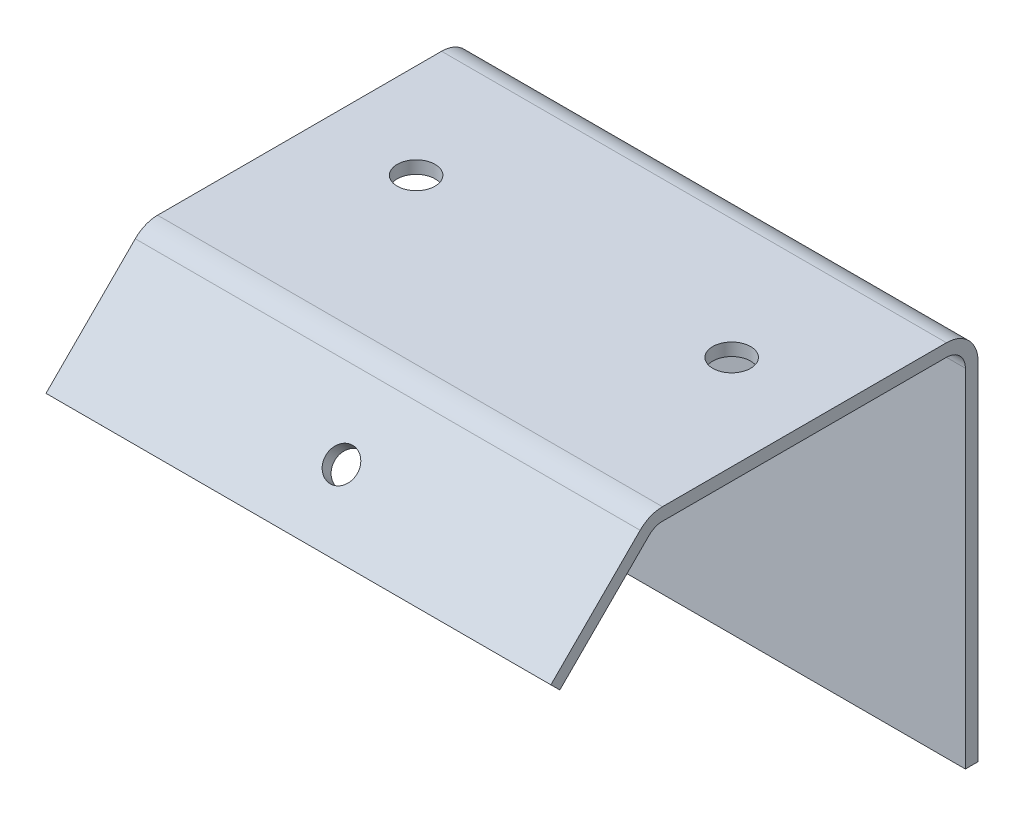
ISO-10303-21;
HEADER;
FILE_DESCRIPTION(('STEP AP214'),'2;1');
FILE_NAME('part.step','',(''),(''),'','','');
FILE_SCHEMA(('AUTOMOTIVE_DESIGN { 1 0 10303 214 1 1 1 1 }'));
ENDSEC;
DATA;
#1=APPLICATION_CONTEXT('core data for automotive mechanical design processes');
#2=APPLICATION_PROTOCOL_DEFINITION('international standard','automotive_design',2000,#1);
#3=PRODUCT_CONTEXT('',#1,'mechanical');
#4=PRODUCT('Part','Part','',(#3));
#5=PRODUCT_RELATED_PRODUCT_CATEGORY('part','',(#4));
#6=PRODUCT_DEFINITION_FORMATION('','',#4);
#7=PRODUCT_DEFINITION_CONTEXT('part definition',#1,'design');
#8=PRODUCT_DEFINITION('design','',#6,#7);
#9=PRODUCT_DEFINITION_SHAPE('','',#8);
#10=(LENGTH_UNIT() NAMED_UNIT(*) SI_UNIT(.MILLI.,.METRE.));
#11=(NAMED_UNIT(*) PLANE_ANGLE_UNIT() SI_UNIT($,.RADIAN.));
#12=(NAMED_UNIT(*) SI_UNIT($,.STERADIAN.) SOLID_ANGLE_UNIT());
#13=UNCERTAINTY_MEASURE_WITH_UNIT(LENGTH_MEASURE(1.E-05),#10,'distance_accuracy_value','');
#14=(GEOMETRIC_REPRESENTATION_CONTEXT(3) GLOBAL_UNCERTAINTY_ASSIGNED_CONTEXT((#13)) GLOBAL_UNIT_ASSIGNED_CONTEXT((#10,
#11,#12)) REPRESENTATION_CONTEXT('',''));
#15=CARTESIAN_POINT('',(0.,0.,0.));
#16=DIRECTION('',(0.,0.,1.));
#17=DIRECTION('',(1.,0.,0.));
#18=AXIS2_PLACEMENT_3D('',#15,#16,#17);
#19=CARTESIAN_POINT('',(40.,-5.28262386525342E-07,1.99999978118658));
#20=DIRECTION('',(0.,1.,0.));
#21=DIRECTION('',(0.,0.,1.));
#22=AXIS2_PLACEMENT_3D('',#19,#20,#21);
#23=PLANE('',#22);
#24=DIRECTION('',(0.,0.,-1.));
#25=VECTOR('',#24,1.);
#26=CARTESIAN_POINT('',(-40.,-5.28262386525342E-07,1.99999978118658));
#27=LINE('',#26,#25);
#28=CARTESIAN_POINT('',(-40.,-5.28262386525342E-07,1.99999978118658));
#29=VERTEX_POINT('',#28);
#30=CARTESIAN_POINT('',(-40.,-5.28262386525342E-07,-8.37711369456456E-07));
#31=VERTEX_POINT('',#30);
#32=EDGE_CURVE('E187',#29,#31,#27,.T.);
#33=ORIENTED_EDGE('',*,*,#32,.T.);
#34=DIRECTION('',(-1.,0.,0.));
#35=VECTOR('',#34,1.);
#36=CARTESIAN_POINT('',(40.,-5.28262386525342E-07,-8.37711369456456E-07));
#37=LINE('',#36,#35);
#38=CARTESIAN_POINT('',(40.,-5.28262386525342E-07,-8.37711369456456E-07));
#39=VERTEX_POINT('',#38);
#40=EDGE_CURVE('E12',#39,#31,#37,.T.);
#41=ORIENTED_EDGE('',*,*,#40,.F.);
#42=DIRECTION('',(0.,0.,-1.));
#43=VECTOR('',#42,1.);
#44=CARTESIAN_POINT('',(40.,-5.28262386525342E-07,1.99999978118658));
#45=LINE('',#44,#43);
#46=CARTESIAN_POINT('',(40.,-5.28262386525342E-07,1.99999978118658));
#47=VERTEX_POINT('',#46);
#48=EDGE_CURVE('E221',#47,#39,#45,.T.);
#49=ORIENTED_EDGE('',*,*,#48,.F.);
#50=DIRECTION('',(-1.,0.,0.));
#51=VECTOR('',#50,1.);
#52=CARTESIAN_POINT('',(40.,-5.28262386525342E-07,1.99999978118658));
#53=LINE('',#52,#51);
#54=EDGE_CURVE('E183',#47,#29,#53,.T.);
#55=ORIENTED_EDGE('',*,*,#54,.T.);
#56=EDGE_LOOP('',(#33,#41,#49,#55));
#57=FACE_BOUND('',#56,.T.);
#58=ADVANCED_FACE('F57',(#57),#23,.F.);
#59=CARTESIAN_POINT('',(40.,-5.28262386525342E-07,-8.37711369456456E-07));
#60=DIRECTION('',(0.,0.,1.));
#61=DIRECTION('',(0.,-1.,0.));
#62=AXIS2_PLACEMENT_3D('',#59,#60,#61);
#63=PLANE('',#62);
#64=CARTESIAN_POINT('',(0.,25.,0.));
#65=DIRECTION('',(0.,0.,1.));
#66=DIRECTION('',(1.,0.,0.));
#67=AXIS2_PLACEMENT_3D('',#64,#65,#66);
#68=CIRCLE('',#67,4.);
#69=CARTESIAN_POINT('',(4.,25.,0.));
#70=VERTEX_POINT('',#69);
#71=EDGE_CURVE('E257',#70,#70,#68,.T.);
#72=ORIENTED_EDGE('',*,*,#71,.T.);
#73=EDGE_LOOP('',(#72));
#74=FACE_BOUND('',#73,.T.);
#75=DIRECTION('',(0.,1.,0.));
#76=VECTOR('',#75,1.);
#77=CARTESIAN_POINT('',(-40.,-5.28262386525342E-07,-8.37711369456456E-07));
#78=LINE('',#77,#76);
#79=CARTESIAN_POINT('',(-40.,54.9999994717376,-8.37711369550418E-07));
#80=VERTEX_POINT('',#79);
#81=EDGE_CURVE('E191',#31,#80,#78,.T.);
#82=ORIENTED_EDGE('',*,*,#81,.T.);
#83=DIRECTION('',(-1.,0.,0.));
#84=VECTOR('',#83,1.);
#85=CARTESIAN_POINT('',(40.,54.9999994717376,-8.37711369550418E-07));
#86=LINE('',#85,#84);
#87=CARTESIAN_POINT('',(40.,54.9999994717376,-8.37711369550418E-07));
#88=VERTEX_POINT('',#87);
#89=EDGE_CURVE('E68',#88,#80,#86,.T.);
#90=ORIENTED_EDGE('',*,*,#89,.F.);
#91=DIRECTION('',(0.,1.,0.));
#92=VECTOR('',#91,1.);
#93=CARTESIAN_POINT('',(40.,-5.28262386525342E-07,-8.37711369456456E-07));
#94=LINE('',#93,#92);
#95=EDGE_CURVE('E132',#39,#88,#94,.T.);
#96=ORIENTED_EDGE('',*,*,#95,.F.);
#97=ORIENTED_EDGE('',*,*,#40,.T.);
#98=EDGE_LOOP('',(#82,#90,#96,#97));
#99=FACE_BOUND('',#98,.T.);
#100=ADVANCED_FACE('F351',(#74,#99),#63,.F.);
#101=CARTESIAN_POINT('',(40.,54.9999997929033,4.99999946002087));
#102=DIRECTION('',(-1.,0.,0.));
#103=DIRECTION('',(0.,0.,1.));
#104=AXIS2_PLACEMENT_3D('',#101,#102,#103);
#105=CYLINDRICAL_SURFACE('',#104,5.00000029773225);
#106=CARTESIAN_POINT('',(-40.,54.9999997929033,4.99999946002087));
#107=DIRECTION('',(1.,0.,0.));
#108=DIRECTION('',(0.,0.,-1.));
#109=AXIS2_PLACEMENT_3D('',#106,#107,#108);
#110=CIRCLE('',#109,5.00000029773225);
#111=CARTESIAN_POINT('',(-40.,60.0000000906356,4.99999978118641));
#112=VERTEX_POINT('',#111);
#113=EDGE_CURVE('E195',#80,#112,#110,.T.);
#114=ORIENTED_EDGE('',*,*,#113,.T.);
#115=DIRECTION('',(-1.,0.,0.));
#116=VECTOR('',#115,1.);
#117=CARTESIAN_POINT('',(40.,60.0000000906356,4.99999978118641));
#118=LINE('',#117,#116);
#119=CARTESIAN_POINT('',(40.,60.0000000906356,4.99999978118641));
#120=VERTEX_POINT('',#119);
#121=EDGE_CURVE('E247',#120,#112,#118,.T.);
#122=ORIENTED_EDGE('',*,*,#121,.F.);
#123=CARTESIAN_POINT('',(40.,54.9999997929033,4.99999946002087));
#124=DIRECTION('',(1.,0.,0.));
#125=DIRECTION('',(0.,0.,-1.));
#126=AXIS2_PLACEMENT_3D('',#123,#124,#125);
#127=CIRCLE('',#126,5.00000029773225);
#128=EDGE_CURVE('E281',#88,#120,#127,.T.);
#129=ORIENTED_EDGE('',*,*,#128,.F.);
#130=ORIENTED_EDGE('',*,*,#89,.T.);
#131=EDGE_LOOP('',(#114,#122,#129,#130));
#132=FACE_BOUND('',#131,.T.);
#133=ADVANCED_FACE('F319',(#132),#105,.T.);
#134=CARTESIAN_POINT('',(40.,60.0000000906356,4.99999978118641));
#135=DIRECTION('',(0.,-1.,0.));
#136=DIRECTION('',(0.,0.,-1.));
#137=AXIS2_PLACEMENT_3D('',#134,#135,#136);
#138=PLANE('',#137);
#139=CARTESIAN_POINT('',(-25.,60.,24.031));
#140=DIRECTION('',(0.,1.,0.));
#141=DIRECTION('',(0.,0.,1.));
#142=AXIS2_PLACEMENT_3D('',#139,#140,#141);
#143=CIRCLE('',#142,3.);
#144=CARTESIAN_POINT('',(-25.,60.,27.031));
#145=VERTEX_POINT('',#144);
#146=EDGE_CURVE('E262',#145,#145,#143,.T.);
#147=ORIENTED_EDGE('',*,*,#146,.F.);
#148=EDGE_LOOP('',(#147));
#149=FACE_BOUND('',#148,.T.);
#150=CARTESIAN_POINT('',(25.,60.,24.031));
#151=DIRECTION('',(0.,1.,0.));
#152=DIRECTION('',(0.,0.,1.));
#153=AXIS2_PLACEMENT_3D('',#150,#151,#152);
#154=CIRCLE('',#153,3.);
#155=CARTESIAN_POINT('',(25.,60.,27.031));
#156=VERTEX_POINT('',#155);
#157=EDGE_CURVE('E275',#156,#156,#154,.T.);
#158=ORIENTED_EDGE('',*,*,#157,.F.);
#159=EDGE_LOOP('',(#158));
#160=FACE_BOUND('',#159,.T.);
#161=DIRECTION('',(0.,0.,1.));
#162=VECTOR('',#161,1.);
#163=CARTESIAN_POINT('',(-40.,60.0000000906356,4.99999978118641));
#164=LINE('',#163,#162);
#165=CARTESIAN_POINT('',(-40.,60.0000000906356,49.9999997811864));
#166=VERTEX_POINT('',#165);
#167=EDGE_CURVE('E198',#112,#166,#164,.T.);
#168=ORIENTED_EDGE('',*,*,#167,.T.);
#169=DIRECTION('',(-1.,0.,0.));
#170=VECTOR('',#169,1.);
#171=CARTESIAN_POINT('',(40.,60.0000000906356,49.9999997811864));
#172=LINE('',#171,#170);
#173=CARTESIAN_POINT('',(40.,60.0000000906356,49.9999997811864));
#174=VERTEX_POINT('',#173);
#175=EDGE_CURVE('E243',#174,#166,#172,.T.);
#176=ORIENTED_EDGE('',*,*,#175,.F.);
#177=DIRECTION('',(0.,0.,1.));
#178=VECTOR('',#177,1.);
#179=CARTESIAN_POINT('',(40.,60.0000000906356,4.99999978118641));
#180=LINE('',#179,#178);
#181=EDGE_CURVE('E284',#120,#174,#180,.T.);
#182=ORIENTED_EDGE('',*,*,#181,.F.);
#183=ORIENTED_EDGE('',*,*,#121,.T.);
#184=EDGE_LOOP('',(#168,#176,#182,#183));
#185=FACE_BOUND('',#184,.T.);
#186=ADVANCED_FACE('F315',(#149,#160,#185),#138,.F.);
#187=CARTESIAN_POINT('',(40.,55.0000019395586,50.0000008633479));
#188=DIRECTION('',(-1.,0.,0.));
#189=DIRECTION('',(0.,0.,1.));
#190=AXIS2_PLACEMENT_3D('',#187,#188,#189);
#191=CYLINDRICAL_SURFACE('',#190,4.99999815107709);
#192=CARTESIAN_POINT('',(-40.,55.0000019395586,50.0000008633479));
#193=DIRECTION('',(1.,0.,0.));
#194=DIRECTION('',(0.,0.,-1.));
#195=AXIS2_PLACEMENT_3D('',#192,#193,#194);
#196=CIRCLE('',#195,4.99999815107709);
#197=CARTESIAN_POINT('',(-40.,58.535534,53.535534));
#198=VERTEX_POINT('',#197);
#199=EDGE_CURVE('E201',#166,#198,#196,.T.);
#200=ORIENTED_EDGE('',*,*,#199,.T.);
#201=DIRECTION('',(-1.,0.,0.));
#202=VECTOR('',#201,1.);
#203=CARTESIAN_POINT('',(40.,58.535534,53.535534));
#204=LINE('',#203,#202);
#205=CARTESIAN_POINT('',(40.,58.535534,53.535534));
#206=VERTEX_POINT('',#205);
#207=EDGE_CURVE('E239',#206,#198,#204,.T.);
#208=ORIENTED_EDGE('',*,*,#207,.F.);
#209=CARTESIAN_POINT('',(40.,55.0000019395586,50.0000008633479));
#210=DIRECTION('',(1.,0.,0.));
#211=DIRECTION('',(0.,0.,-1.));
#212=AXIS2_PLACEMENT_3D('',#209,#210,#211);
#213=CIRCLE('',#212,4.99999815107709);
#214=EDGE_CURVE('E287',#174,#206,#213,.T.);
#215=ORIENTED_EDGE('',*,*,#214,.F.);
#216=ORIENTED_EDGE('',*,*,#175,.T.);
#217=EDGE_LOOP('',(#200,#208,#215,#216));
#218=FACE_BOUND('',#217,.T.);
#219=ADVANCED_FACE('F318',(#218),#191,.T.);
#220=CARTESIAN_POINT('',(40.,58.535534,53.535534));
#221=DIRECTION('',(0.,-0.707106781186548,-0.707106781186547));
#222=DIRECTION('',(0.,0.707106781186547,-0.707106781186548));
#223=AXIS2_PLACEMENT_3D('',#220,#221,#222);
#224=PLANE('',#223);
#225=CARTESIAN_POINT('',(0.,51.213034,60.858034));
#226=DIRECTION('',(0.,-0.707106781186548,-0.707106781186547));
#227=DIRECTION('',(0.,0.707106781186547,-0.707106781186548));
#228=AXIS2_PLACEMENT_3D('',#225,#226,#227);
#229=CIRCLE('',#228,2.5);
#230=CARTESIAN_POINT('',(0.,52.9808009529664,59.0902670470336));
#231=VERTEX_POINT('',#230);
#232=EDGE_CURVE('E300',#231,#231,#229,.T.);
#233=ORIENTED_EDGE('',*,*,#232,.T.);
#234=EDGE_LOOP('',(#233));
#235=FACE_BOUND('',#234,.T.);
#236=DIRECTION('',(0.,-0.707106781186547,0.707106781186548));
#237=VECTOR('',#236,1.);
#238=CARTESIAN_POINT('',(-40.,58.535534,53.535534));
#239=LINE('',#238,#237);
#240=CARTESIAN_POINT('',(-40.,44.393398,67.67767));
#241=VERTEX_POINT('',#240);
#242=EDGE_CURVE('E204',#198,#241,#239,.T.);
#243=ORIENTED_EDGE('',*,*,#242,.T.);
#244=DIRECTION('',(-1.,0.,0.));
#245=VECTOR('',#244,1.);
#246=CARTESIAN_POINT('',(40.,44.393398,67.67767));
#247=LINE('',#246,#245);
#248=CARTESIAN_POINT('',(40.,44.393398,67.67767));
#249=VERTEX_POINT('',#248);
#250=EDGE_CURVE('E236',#249,#241,#247,.T.);
#251=ORIENTED_EDGE('',*,*,#250,.F.);
#252=DIRECTION('',(0.,-0.707106781186547,0.707106781186548));
#253=VECTOR('',#252,1.);
#254=CARTESIAN_POINT('',(40.,58.535534,53.535534));
#255=LINE('',#254,#253);
#256=EDGE_CURVE('E290',#206,#249,#255,.T.);
#257=ORIENTED_EDGE('',*,*,#256,.F.);
#258=ORIENTED_EDGE('',*,*,#207,.T.);
#259=EDGE_LOOP('',(#243,#251,#257,#258));
#260=FACE_BOUND('',#259,.T.);
#261=ADVANCED_FACE('F340',(#235,#260),#224,.F.);
#262=CARTESIAN_POINT('',(40.,44.393398,67.67767));
#263=DIRECTION('',(0.,0.707158756840208,-0.707054801712153));
#264=DIRECTION('',(0.,0.707054801712153,0.707158756840208));
#265=AXIS2_PLACEMENT_3D('',#262,#263,#264);
#266=PLANE('',#265);
#267=DIRECTION('',(0.,-0.707054801712153,-0.707158756840208));
#268=VECTOR('',#267,1.);
#269=CARTESIAN_POINT('',(-40.,44.393398,67.67767));
#270=LINE('',#269,#268);
#271=CARTESIAN_POINT('',(-40.,42.978678,66.262742));
#272=VERTEX_POINT('',#271);
#273=EDGE_CURVE('E207',#241,#272,#270,.T.);
#274=ORIENTED_EDGE('',*,*,#273,.T.);
#275=DIRECTION('',(-1.,0.,0.));
#276=VECTOR('',#275,1.);
#277=CARTESIAN_POINT('',(40.,42.978678,66.262742));
#278=LINE('',#277,#276);
#279=CARTESIAN_POINT('',(40.,42.978678,66.262742));
#280=VERTEX_POINT('',#279);
#281=EDGE_CURVE('E232',#280,#272,#278,.T.);
#282=ORIENTED_EDGE('',*,*,#281,.F.);
#283=DIRECTION('',(0.,-0.707054801712153,-0.707158756840208));
#284=VECTOR('',#283,1.);
#285=CARTESIAN_POINT('',(40.,44.393398,67.67767));
#286=LINE('',#285,#284);
#287=EDGE_CURVE('E293',#249,#280,#286,.T.);
#288=ORIENTED_EDGE('',*,*,#287,.F.);
#289=ORIENTED_EDGE('',*,*,#250,.T.);
#290=EDGE_LOOP('',(#274,#282,#288,#289));
#291=FACE_BOUND('',#290,.T.);
#292=ADVANCED_FACE('F344',(#291),#266,.F.);
#293=CARTESIAN_POINT('',(40.,42.978678,66.262742));
#294=DIRECTION('',(0.,0.707076280305296,0.707137280752208));
#295=DIRECTION('',(0.,-0.707137280752208,0.707076280305296));
#296=AXIS2_PLACEMENT_3D('',#293,#294,#295);
#297=PLANE('',#296);
#298=CARTESIAN_POINT('',(0.,49.798504152532,59.443504152532));
#299=DIRECTION('',(0.,0.707076280305296,0.707137280752208));
#300=DIRECTION('',(0.,-0.707137280752208,0.707076280305296));
#301=AXIS2_PLACEMENT_3D('',#298,#299,#300);
#302=ELLIPSE('',#301,2.50000000232566,2.5);
#303=CARTESIAN_POINT('',(0.,48.0306609490069,61.2111948549396));
#304=VERTEX_POINT('',#303);
#305=EDGE_CURVE('E61',#304,#304,#302,.T.);
#306=ORIENTED_EDGE('',*,*,#305,.T.);
#307=EDGE_LOOP('',(#306));
#308=FACE_BOUND('',#307,.T.);
#309=DIRECTION('',(0.,0.707137280752208,-0.707076280305296));
#310=VECTOR('',#309,1.);
#311=CARTESIAN_POINT('',(-40.,42.978678,66.262742));
#312=LINE('',#311,#310);
#313=CARTESIAN_POINT('',(-40.,57.12132,52.12132));
#314=VERTEX_POINT('',#313);
#315=EDGE_CURVE('E210',#272,#314,#312,.T.);
#316=ORIENTED_EDGE('',*,*,#315,.T.);
#317=DIRECTION('',(-1.,0.,0.));
#318=VECTOR('',#317,1.);
#319=CARTESIAN_POINT('',(40.,57.12132,52.12132));
#320=LINE('',#319,#318);
#321=CARTESIAN_POINT('',(40.,57.12132,52.12132));
#322=VERTEX_POINT('',#321);
#323=EDGE_CURVE('E228',#322,#314,#320,.T.);
#324=ORIENTED_EDGE('',*,*,#323,.F.);
#325=DIRECTION('',(0.,0.707137280752208,-0.707076280305296));
#326=VECTOR('',#325,1.);
#327=CARTESIAN_POINT('',(40.,42.978678,66.262742));
#328=LINE('',#327,#326);
#329=EDGE_CURVE('E295',#280,#322,#328,.T.);
#330=ORIENTED_EDGE('',*,*,#329,.F.);
#331=ORIENTED_EDGE('',*,*,#281,.T.);
#332=EDGE_LOOP('',(#316,#324,#330,#331));
#333=FACE_BOUND('',#332,.T.);
#334=ADVANCED_FACE('F359',(#308,#333),#297,.F.);
#335=CARTESIAN_POINT('',(40.,55.0000019395586,50.0000008633479));
#336=DIRECTION('',(-1.,0.,0.));
#337=DIRECTION('',(0.,0.,1.));
#338=AXIS2_PLACEMENT_3D('',#335,#336,#337);
#339=CYLINDRICAL_SURFACE('',#338,2.99999753217922);
#340=CARTESIAN_POINT('',(-40.,55.0000019395586,50.0000008633479));
#341=DIRECTION('',(-1.,0.,0.));
#342=DIRECTION('',(0.,0.,1.));
#343=AXIS2_PLACEMENT_3D('',#340,#341,#342);
#344=CIRCLE('',#343,2.99999753217922);
#345=CARTESIAN_POINT('',(-40.,57.9999994717376,49.9999997811866));
#346=VERTEX_POINT('',#345);
#347=EDGE_CURVE('E212',#314,#346,#344,.T.);
#348=ORIENTED_EDGE('',*,*,#347,.T.);
#349=DIRECTION('',(-1.,0.,0.));
#350=VECTOR('',#349,1.);
#351=CARTESIAN_POINT('',(40.,57.9999994717376,49.9999997811866));
#352=LINE('',#351,#350);
#353=CARTESIAN_POINT('',(40.,57.9999994717376,49.9999997811866));
#354=VERTEX_POINT('',#353);
#355=EDGE_CURVE('E174',#354,#346,#352,.T.);
#356=ORIENTED_EDGE('',*,*,#355,.F.);
#357=CARTESIAN_POINT('',(40.,55.0000019395586,50.0000008633479));
#358=DIRECTION('',(-1.,0.,0.));
#359=DIRECTION('',(0.,0.,1.));
#360=AXIS2_PLACEMENT_3D('',#357,#358,#359);
#361=CIRCLE('',#360,2.99999753217922);
#362=EDGE_CURVE('E163',#322,#354,#361,.T.);
#363=ORIENTED_EDGE('',*,*,#362,.F.);
#364=ORIENTED_EDGE('',*,*,#323,.T.);
#365=EDGE_LOOP('',(#348,#356,#363,#364));
#366=FACE_BOUND('',#365,.T.);
#367=ADVANCED_FACE('F357',(#366),#339,.F.);
#368=CARTESIAN_POINT('',(40.,57.9999994717376,49.9999997811866));
#369=DIRECTION('',(0.,1.,0.));
#370=DIRECTION('',(0.,0.,1.));
#371=AXIS2_PLACEMENT_3D('',#368,#369,#370);
#372=PLANE('',#371);
#373=CARTESIAN_POINT('',(-25.,57.9999994717376,24.031));
#374=DIRECTION('',(0.,1.,0.));
#375=DIRECTION('',(0.,0.,1.));
#376=AXIS2_PLACEMENT_3D('',#373,#374,#375);
#377=CIRCLE('',#376,3.);
#378=CARTESIAN_POINT('',(-25.,57.9999994717376,27.031));
#379=VERTEX_POINT('',#378);
#380=EDGE_CURVE('E261',#379,#379,#377,.T.);
#381=ORIENTED_EDGE('',*,*,#380,.T.);
#382=EDGE_LOOP('',(#381));
#383=FACE_BOUND('',#382,.T.);
#384=CARTESIAN_POINT('',(25.,57.9999994717376,24.031));
#385=DIRECTION('',(0.,1.,0.));
#386=DIRECTION('',(0.,0.,1.));
#387=AXIS2_PLACEMENT_3D('',#384,#385,#386);
#388=CIRCLE('',#387,3.);
#389=CARTESIAN_POINT('',(25.,57.9999994717376,27.031));
#390=VERTEX_POINT('',#389);
#391=EDGE_CURVE('E258',#390,#390,#388,.T.);
#392=ORIENTED_EDGE('',*,*,#391,.T.);
#393=EDGE_LOOP('',(#392));
#394=FACE_BOUND('',#393,.T.);
#395=DIRECTION('',(0.,0.,-1.));
#396=VECTOR('',#395,1.);
#397=CARTESIAN_POINT('',(-40.,57.9999994717376,49.9999997811866));
#398=LINE('',#397,#396);
#399=CARTESIAN_POINT('',(-40.,57.9999994717376,4.99999978118659));
#400=VERTEX_POINT('',#399);
#401=EDGE_CURVE('E172',#346,#400,#398,.T.);
#402=ORIENTED_EDGE('',*,*,#401,.T.);
#403=DIRECTION('',(-1.,0.,0.));
#404=VECTOR('',#403,1.);
#405=CARTESIAN_POINT('',(40.,57.9999994717376,4.99999978118659));
#406=LINE('',#405,#404);
#407=CARTESIAN_POINT('',(40.,57.9999994717376,4.99999978118659));
#408=VERTEX_POINT('',#407);
#409=EDGE_CURVE('E169',#408,#400,#406,.T.);
#410=ORIENTED_EDGE('',*,*,#409,.F.);
#411=DIRECTION('',(0.,0.,-1.));
#412=VECTOR('',#411,1.);
#413=CARTESIAN_POINT('',(40.,57.9999994717376,49.9999997811866));
#414=LINE('',#413,#412);
#415=EDGE_CURVE('E157',#354,#408,#414,.T.);
#416=ORIENTED_EDGE('',*,*,#415,.F.);
#417=ORIENTED_EDGE('',*,*,#355,.T.);
#418=EDGE_LOOP('',(#402,#410,#416,#417));
#419=FACE_BOUND('',#418,.T.);
#420=ADVANCED_FACE('F170',(#383,#394,#419),#372,.F.);
#421=CARTESIAN_POINT('',(40.,54.9999997929033,4.99999946002087));
#422=DIRECTION('',(-1.,0.,0.));
#423=DIRECTION('',(0.,0.,1.));
#424=AXIS2_PLACEMENT_3D('',#421,#422,#423);
#425=CYLINDRICAL_SURFACE('',#424,2.9999996788343);
#426=CARTESIAN_POINT('',(-40.,54.9999997929033,4.99999946002087));
#427=DIRECTION('',(-1.,0.,0.));
#428=DIRECTION('',(0.,0.,1.));
#429=AXIS2_PLACEMENT_3D('',#426,#427,#428);
#430=CIRCLE('',#429,2.9999996788343);
#431=CARTESIAN_POINT('',(-40.,54.9999994717376,1.99999978118658));
#432=VERTEX_POINT('',#431);
#433=EDGE_CURVE('E118',#400,#432,#430,.T.);
#434=ORIENTED_EDGE('',*,*,#433,.T.);
#435=DIRECTION('',(-1.,0.,0.));
#436=VECTOR('',#435,1.);
#437=CARTESIAN_POINT('',(40.,54.9999994717376,1.99999978118658));
#438=LINE('',#437,#436);
#439=CARTESIAN_POINT('',(40.,54.9999994717376,1.99999978118658));
#440=VERTEX_POINT('',#439);
#441=EDGE_CURVE('E175',#440,#432,#438,.T.);
#442=ORIENTED_EDGE('',*,*,#441,.F.);
#443=CARTESIAN_POINT('',(40.,54.9999997929033,4.99999946002087));
#444=DIRECTION('',(-1.,0.,0.));
#445=DIRECTION('',(0.,0.,1.));
#446=AXIS2_PLACEMENT_3D('',#443,#444,#445);
#447=CIRCLE('',#446,2.9999996788343);
#448=EDGE_CURVE('E161',#408,#440,#447,.T.);
#449=ORIENTED_EDGE('',*,*,#448,.F.);
#450=ORIENTED_EDGE('',*,*,#409,.T.);
#451=EDGE_LOOP('',(#434,#442,#449,#450));
#452=FACE_BOUND('',#451,.T.);
#453=ADVANCED_FACE('F177',(#452),#425,.F.);
#454=CARTESIAN_POINT('',(40.,54.9999994717376,1.99999978118658));
#455=DIRECTION('',(0.,0.,-1.));
#456=DIRECTION('',(-1.,0.,0.));
#457=AXIS2_PLACEMENT_3D('',#454,#455,#456);
#458=PLANE('',#457);
#459=CARTESIAN_POINT('',(0.,25.,1.99999978118658));
#460=DIRECTION('',(0.,0.,-1.));
#461=DIRECTION('',(-1.,0.,0.));
#462=AXIS2_PLACEMENT_3D('',#459,#460,#461);
#463=CIRCLE('',#462,4.);
#464=CARTESIAN_POINT('',(-4.,25.,1.99999978118658));
#465=VERTEX_POINT('',#464);
#466=EDGE_CURVE('E192',#465,#465,#463,.F.);
#467=ORIENTED_EDGE('',*,*,#466,.F.);
#468=EDGE_LOOP('',(#467));
#469=FACE_BOUND('',#468,.T.);
#470=DIRECTION('',(0.,-1.,0.));
#471=VECTOR('',#470,1.);
#472=CARTESIAN_POINT('',(-40.,54.9999994717376,1.99999978118658));
#473=LINE('',#472,#471);
#474=EDGE_CURVE('E124',#432,#29,#473,.T.);
#475=ORIENTED_EDGE('',*,*,#474,.T.);
#476=ORIENTED_EDGE('',*,*,#54,.F.);
#477=DIRECTION('',(0.,-1.,0.));
#478=VECTOR('',#477,1.);
#479=CARTESIAN_POINT('',(40.,54.9999994717376,1.99999978118658));
#480=LINE('',#479,#478);
#481=EDGE_CURVE('E77',#440,#47,#480,.T.);
#482=ORIENTED_EDGE('',*,*,#481,.F.);
#483=ORIENTED_EDGE('',*,*,#441,.T.);
#484=EDGE_LOOP('',(#475,#476,#482,#483));
#485=FACE_BOUND('',#484,.T.);
#486=ADVANCED_FACE('F354',(#469,#485),#458,.F.);
#487=CARTESIAN_POINT('',(40.,54.9999997929033,4.99999946002087));
#488=DIRECTION('',(1.,0.,0.));
#489=DIRECTION('',(0.,0.,-1.));
#490=AXIS2_PLACEMENT_3D('',#487,#488,#489);
#491=PLANE('',#490);
#492=ORIENTED_EDGE('',*,*,#48,.T.);
#493=ORIENTED_EDGE('',*,*,#95,.T.);
#494=ORIENTED_EDGE('',*,*,#128,.T.);
#495=ORIENTED_EDGE('',*,*,#181,.T.);
#496=ORIENTED_EDGE('',*,*,#214,.T.);
#497=ORIENTED_EDGE('',*,*,#256,.T.);
#498=ORIENTED_EDGE('',*,*,#287,.T.);
#499=ORIENTED_EDGE('',*,*,#329,.T.);
#500=ORIENTED_EDGE('',*,*,#362,.T.);
#501=ORIENTED_EDGE('',*,*,#415,.T.);
#502=ORIENTED_EDGE('',*,*,#448,.T.);
#503=ORIENTED_EDGE('',*,*,#481,.T.);
#504=EDGE_LOOP('',(#492,#493,#494,#495,#496,#497,#498,#499,#500,#501,#502,#503));
#505=FACE_BOUND('',#504,.T.);
#506=ADVANCED_FACE('F159',(#505),#491,.T.);
#507=CARTESIAN_POINT('',(-40.,54.9999997929033,4.99999946002087));
#508=DIRECTION('',(1.,0.,0.));
#509=DIRECTION('',(0.,0.,-1.));
#510=AXIS2_PLACEMENT_3D('',#507,#508,#509);
#511=PLANE('',#510);
#512=ORIENTED_EDGE('',*,*,#32,.F.);
#513=ORIENTED_EDGE('',*,*,#474,.F.);
#514=ORIENTED_EDGE('',*,*,#433,.F.);
#515=ORIENTED_EDGE('',*,*,#401,.F.);
#516=ORIENTED_EDGE('',*,*,#347,.F.);
#517=ORIENTED_EDGE('',*,*,#315,.F.);
#518=ORIENTED_EDGE('',*,*,#273,.F.);
#519=ORIENTED_EDGE('',*,*,#242,.F.);
#520=ORIENTED_EDGE('',*,*,#199,.F.);
#521=ORIENTED_EDGE('',*,*,#167,.F.);
#522=ORIENTED_EDGE('',*,*,#113,.F.);
#523=ORIENTED_EDGE('',*,*,#81,.F.);
#524=EDGE_LOOP('',(#512,#513,#514,#515,#516,#517,#518,#519,#520,#521,#522,#523));
#525=FACE_BOUND('',#524,.T.);
#526=ADVANCED_FACE('F335',(#525),#511,.F.);
#527=CARTESIAN_POINT('',(0.,25.,67.67767));
#528=DIRECTION('',(0.,0.,-1.));
#529=DIRECTION('',(-1.,0.,0.));
#530=AXIS2_PLACEMENT_3D('',#527,#528,#529);
#531=CYLINDRICAL_SURFACE('',#530,4.);
#532=ORIENTED_EDGE('',*,*,#71,.F.);
#533=EDGE_LOOP('',(#532));
#534=FACE_BOUND('',#533,.T.);
#535=ORIENTED_EDGE('',*,*,#466,.T.);
#536=EDGE_LOOP('',(#535));
#537=FACE_BOUND('',#536,.T.);
#538=ADVANCED_FACE('F399',(#534,#537),#531,.F.);
#539=CARTESIAN_POINT('',(25.,-5.28262385224298E-07,24.031));
#540=DIRECTION('',(0.,1.,0.));
#541=DIRECTION('',(0.,0.,1.));
#542=AXIS2_PLACEMENT_3D('',#539,#540,#541);
#543=CYLINDRICAL_SURFACE('',#542,3.);
#544=CARTESIAN_POINT('',(25.,60.,27.031));
#545=CARTESIAN_POINT('',(25.,59.9791666611639,27.031));
#546=CARTESIAN_POINT('',(25.,59.9583333223279,27.031));
#547=CARTESIAN_POINT('',(25.,59.9166666446557,27.031));
#548=CARTESIAN_POINT('',(25.,59.8958333058197,27.031));
#549=CARTESIAN_POINT('',(25.,59.8541666281475,27.031));
#550=CARTESIAN_POINT('',(25.,59.8333332893115,27.031));
#551=CARTESIAN_POINT('',(25.,59.7916666116393,27.031));
#552=CARTESIAN_POINT('',(25.,59.7708332728033,27.031));
#553=CARTESIAN_POINT('',(25.,59.7291665951311,27.031));
#554=CARTESIAN_POINT('',(25.,59.7083332562951,27.031));
#555=CARTESIAN_POINT('',(25.,59.6666665786229,27.031));
#556=CARTESIAN_POINT('',(25.,59.6458332397869,27.031));
#557=CARTESIAN_POINT('',(25.,59.6041665621147,27.031));
#558=CARTESIAN_POINT('',(25.,59.5833332232787,27.031));
#559=CARTESIAN_POINT('',(25.,59.5416665456065,27.031));
#560=CARTESIAN_POINT('',(25.,59.5208332067705,27.031));
#561=CARTESIAN_POINT('',(25.,59.4791665290983,27.031));
#562=CARTESIAN_POINT('',(25.,59.4583331902623,27.031));
#563=CARTESIAN_POINT('',(25.,59.4166665125901,27.031));
#564=CARTESIAN_POINT('',(25.,59.3958331737541,27.031));
#565=CARTESIAN_POINT('',(25.,59.3541664960819,27.031));
#566=CARTESIAN_POINT('',(25.,59.3333331572459,27.031));
#567=CARTESIAN_POINT('',(25.,59.2916664795737,27.031));
#568=CARTESIAN_POINT('',(25.,59.2708331407377,27.031));
#569=CARTESIAN_POINT('',(25.,59.2291664630655,27.031));
#570=CARTESIAN_POINT('',(25.,59.2083331242295,27.031));
#571=CARTESIAN_POINT('',(25.,59.1666664465573,27.031));
#572=CARTESIAN_POINT('',(25.,59.1458331077213,27.031));
#573=CARTESIAN_POINT('',(25.,59.1041664300491,27.031));
#574=CARTESIAN_POINT('',(25.,59.0833330912131,27.031));
#575=CARTESIAN_POINT('',(25.,59.0416664135409,27.031));
#576=CARTESIAN_POINT('',(25.,59.0208330747049,27.031));
#577=CARTESIAN_POINT('',(25.,58.9791663970327,27.031));
#578=CARTESIAN_POINT('',(25.,58.9583330581967,27.031));
#579=CARTESIAN_POINT('',(25.,58.9166663805245,27.031));
#580=CARTESIAN_POINT('',(25.,58.8958330416885,27.031));
#581=CARTESIAN_POINT('',(25.,58.8541663640163,27.031));
#582=CARTESIAN_POINT('',(25.,58.8333330251803,27.031));
#583=CARTESIAN_POINT('',(25.,58.7916663475081,27.031));
#584=CARTESIAN_POINT('',(25.,58.7708330086721,27.031));
#585=CARTESIAN_POINT('',(25.,58.7291663309999,27.031));
#586=CARTESIAN_POINT('',(25.,58.7083329921639,27.031));
#587=CARTESIAN_POINT('',(25.,58.6666663144917,27.031));
#588=CARTESIAN_POINT('',(25.,58.6458329756557,27.031));
#589=CARTESIAN_POINT('',(25.,58.6041662979835,27.031));
#590=CARTESIAN_POINT('',(25.,58.5833329591475,27.031));
#591=CARTESIAN_POINT('',(25.,58.5416662814753,27.031));
#592=CARTESIAN_POINT('',(25.,58.5208329426393,27.031));
#593=CARTESIAN_POINT('',(25.,58.4791662649671,27.031));
#594=CARTESIAN_POINT('',(25.,58.4583329261311,27.031));
#595=CARTESIAN_POINT('',(25.,58.4166662484589,27.031));
#596=CARTESIAN_POINT('',(25.,58.3958329096229,27.031));
#597=CARTESIAN_POINT('',(25.,58.3541662319507,27.031));
#598=CARTESIAN_POINT('',(25.,58.3333328931147,27.031));
#599=CARTESIAN_POINT('',(25.,58.2916662154425,27.031));
#600=CARTESIAN_POINT('',(25.,58.2708328766065,27.031));
#601=CARTESIAN_POINT('',(25.,58.2291661989343,27.031));
#602=CARTESIAN_POINT('',(25.,58.2083328600983,27.031));
#603=CARTESIAN_POINT('',(25.,58.1666661824261,27.031));
#604=CARTESIAN_POINT('',(25.,58.1458328435901,27.031));
#605=CARTESIAN_POINT('',(25.,58.1041661659179,27.031));
#606=CARTESIAN_POINT('',(25.,58.0833328270819,27.031));
#607=CARTESIAN_POINT('',(25.,58.0416661494097,27.031));
#608=CARTESIAN_POINT('',(25.,58.0208328105737,27.031));
#609=CARTESIAN_POINT('',(25.,57.9999994717376,27.031));
#610=B_SPLINE_CURVE_WITH_KNOTS('',3,(#544,#545,#546,#547,#548,#549,#550,#551,#552,#553,#554,
#555,#556,#557,#558,#559,#560,#561,#562,#563,#564,#565,#566,#567,#568,#569,#570,#571,#572,#573,
#574,#575,#576,#577,#578,#579,#580,#581,#582,#583,#584,#585,#586,#587,#588,#589,#590,#591,#592,
#593,#594,#595,#596,#597,#598,#599,#600,#601,#602,#603,#604,#605,#606,#607,#608,#609),
.UNSPECIFIED.,.F.,.F.,(4,2,2,2,2,2,2,2,2,2,2,2,2,2,2,2,2,2,2,2,2,2,2,2,2,2,2,2,2,2,2,2,4),(0.,
0.0625000165081976,0.125000033016402,0.1875000495246,0.250000066032798,0.312500082541002,
0.3750000990492,0.437500115557397,0.500000132065595,0.5625001485738,0.625000165081997,
0.687500181590195,0.750000198098399,0.812500214606597,0.875000231114795,0.937500247622999,
1.0000002641312,1.06250028063939,1.1250002971476,1.1875003136558,1.25000033016399,
1.3125003466722,1.3750003631804,1.43750037968859,1.5000003961968,1.562500412705,
1.62500042921319,1.68750044572139,1.7500004622296,1.81250047873779,1.87500049524599,
1.9375005117542,2.00000052826239),.UNSPECIFIED.);
#611=EDGE_CURVE('BSEAM402',#156,#390,#610,.T.);
#612=ORIENTED_EDGE('',*,*,#157,.T.);
#613=ORIENTED_EDGE('',*,*,#391,.F.);
#614=ORIENTED_EDGE('',*,*,#611,.T.);
#615=ORIENTED_EDGE('',*,*,#611,.F.);
#616=EDGE_LOOP('',(#612,#614,#613,#615));
#617=FACE_BOUND('',#616,.T.);
#618=ADVANCED_FACE('F402',(#617),#543,.F.);
#619=CARTESIAN_POINT('',(-25.,-5.28262385224298E-07,24.031));
#620=DIRECTION('',(0.,1.,0.));
#621=DIRECTION('',(0.,0.,1.));
#622=AXIS2_PLACEMENT_3D('',#619,#620,#621);
#623=CYLINDRICAL_SURFACE('',#622,3.);
#624=CARTESIAN_POINT('',(-25.,60.,27.031));
#625=CARTESIAN_POINT('',(-25.,59.9791666611639,27.031));
#626=CARTESIAN_POINT('',(-25.,59.9583333223279,27.031));
#627=CARTESIAN_POINT('',(-25.,59.9166666446557,27.031));
#628=CARTESIAN_POINT('',(-25.,59.8958333058197,27.031));
#629=CARTESIAN_POINT('',(-25.,59.8541666281475,27.031));
#630=CARTESIAN_POINT('',(-25.,59.8333332893115,27.031));
#631=CARTESIAN_POINT('',(-25.,59.7916666116393,27.031));
#632=CARTESIAN_POINT('',(-25.,59.7708332728033,27.031));
#633=CARTESIAN_POINT('',(-25.,59.7291665951311,27.031));
#634=CARTESIAN_POINT('',(-25.,59.7083332562951,27.031));
#635=CARTESIAN_POINT('',(-25.,59.6666665786229,27.031));
#636=CARTESIAN_POINT('',(-25.,59.6458332397869,27.031));
#637=CARTESIAN_POINT('',(-25.,59.6041665621147,27.031));
#638=CARTESIAN_POINT('',(-25.,59.5833332232787,27.031));
#639=CARTESIAN_POINT('',(-25.,59.5416665456065,27.031));
#640=CARTESIAN_POINT('',(-25.,59.5208332067705,27.031));
#641=CARTESIAN_POINT('',(-25.,59.4791665290983,27.031));
#642=CARTESIAN_POINT('',(-25.,59.4583331902623,27.031));
#643=CARTESIAN_POINT('',(-25.,59.4166665125901,27.031));
#644=CARTESIAN_POINT('',(-25.,59.3958331737541,27.031));
#645=CARTESIAN_POINT('',(-25.,59.3541664960819,27.031));
#646=CARTESIAN_POINT('',(-25.,59.3333331572459,27.031));
#647=CARTESIAN_POINT('',(-25.,59.2916664795737,27.031));
#648=CARTESIAN_POINT('',(-25.,59.2708331407377,27.031));
#649=CARTESIAN_POINT('',(-25.,59.2291664630655,27.031));
#650=CARTESIAN_POINT('',(-25.,59.2083331242295,27.031));
#651=CARTESIAN_POINT('',(-25.,59.1666664465573,27.031));
#652=CARTESIAN_POINT('',(-25.,59.1458331077213,27.031));
#653=CARTESIAN_POINT('',(-25.,59.1041664300491,27.031));
#654=CARTESIAN_POINT('',(-25.,59.0833330912131,27.031));
#655=CARTESIAN_POINT('',(-25.,59.0416664135409,27.031));
#656=CARTESIAN_POINT('',(-25.,59.0208330747049,27.031));
#657=CARTESIAN_POINT('',(-25.,58.9791663970327,27.031));
#658=CARTESIAN_POINT('',(-25.,58.9583330581967,27.031));
#659=CARTESIAN_POINT('',(-25.,58.9166663805245,27.031));
#660=CARTESIAN_POINT('',(-25.,58.8958330416885,27.031));
#661=CARTESIAN_POINT('',(-25.,58.8541663640163,27.031));
#662=CARTESIAN_POINT('',(-25.,58.8333330251803,27.031));
#663=CARTESIAN_POINT('',(-25.,58.7916663475081,27.031));
#664=CARTESIAN_POINT('',(-25.,58.7708330086721,27.031));
#665=CARTESIAN_POINT('',(-25.,58.7291663309999,27.031));
#666=CARTESIAN_POINT('',(-25.,58.7083329921639,27.031));
#667=CARTESIAN_POINT('',(-25.,58.6666663144917,27.031));
#668=CARTESIAN_POINT('',(-25.,58.6458329756557,27.031));
#669=CARTESIAN_POINT('',(-25.,58.6041662979835,27.031));
#670=CARTESIAN_POINT('',(-25.,58.5833329591475,27.031));
#671=CARTESIAN_POINT('',(-25.,58.5416662814753,27.031));
#672=CARTESIAN_POINT('',(-25.,58.5208329426393,27.031));
#673=CARTESIAN_POINT('',(-25.,58.4791662649671,27.031));
#674=CARTESIAN_POINT('',(-25.,58.4583329261311,27.031));
#675=CARTESIAN_POINT('',(-25.,58.4166662484589,27.031));
#676=CARTESIAN_POINT('',(-25.,58.3958329096229,27.031));
#677=CARTESIAN_POINT('',(-25.,58.3541662319507,27.031));
#678=CARTESIAN_POINT('',(-25.,58.3333328931147,27.031));
#679=CARTESIAN_POINT('',(-25.,58.2916662154425,27.031));
#680=CARTESIAN_POINT('',(-25.,58.2708328766065,27.031));
#681=CARTESIAN_POINT('',(-25.,58.2291661989343,27.031));
#682=CARTESIAN_POINT('',(-25.,58.2083328600983,27.031));
#683=CARTESIAN_POINT('',(-25.,58.1666661824261,27.031));
#684=CARTESIAN_POINT('',(-25.,58.1458328435901,27.031));
#685=CARTESIAN_POINT('',(-25.,58.1041661659179,27.031));
#686=CARTESIAN_POINT('',(-25.,58.0833328270819,27.031));
#687=CARTESIAN_POINT('',(-25.,58.0416661494097,27.031));
#688=CARTESIAN_POINT('',(-25.,58.0208328105737,27.031));
#689=CARTESIAN_POINT('',(-25.,57.9999994717376,27.031));
#690=B_SPLINE_CURVE_WITH_KNOTS('',3,(#624,#625,#626,#627,#628,#629,#630,#631,#632,#633,#634,
#635,#636,#637,#638,#639,#640,#641,#642,#643,#644,#645,#646,#647,#648,#649,#650,#651,#652,#653,
#654,#655,#656,#657,#658,#659,#660,#661,#662,#663,#664,#665,#666,#667,#668,#669,#670,#671,#672,
#673,#674,#675,#676,#677,#678,#679,#680,#681,#682,#683,#684,#685,#686,#687,#688,#689),
.UNSPECIFIED.,.F.,.F.,(4,2,2,2,2,2,2,2,2,2,2,2,2,2,2,2,2,2,2,2,2,2,2,2,2,2,2,2,2,2,2,2,4),(0.,
0.0625000165081976,0.125000033016402,0.1875000495246,0.250000066032798,0.312500082541002,
0.3750000990492,0.437500115557397,0.500000132065595,0.5625001485738,0.625000165081997,
0.687500181590195,0.750000198098399,0.812500214606597,0.875000231114795,0.937500247622999,
1.0000002641312,1.06250028063939,1.1250002971476,1.1875003136558,1.25000033016399,
1.3125003466722,1.3750003631804,1.43750037968859,1.5000003961968,1.562500412705,
1.62500042921319,1.68750044572139,1.7500004622296,1.81250047873779,1.87500049524599,
1.9375005117542,2.00000052826239),.UNSPECIFIED.);
#691=EDGE_CURVE('BSEAM312',#145,#379,#690,.T.);
#692=ORIENTED_EDGE('',*,*,#146,.T.);
#693=ORIENTED_EDGE('',*,*,#380,.F.);
#694=ORIENTED_EDGE('',*,*,#691,.T.);
#695=ORIENTED_EDGE('',*,*,#691,.F.);
#696=EDGE_LOOP('',(#692,#694,#693,#695));
#697=FACE_BOUND('',#696,.T.);
#698=ADVANCED_FACE('F312',(#697),#623,.F.);
#699=CARTESIAN_POINT('',(0.,53.11,62.755));
#700=DIRECTION('',(0.,-0.707106781186547,-0.707106781186548));
#701=DIRECTION('',(0.,0.707106781186548,-0.707106781186547));
#702=AXIS2_PLACEMENT_3D('',#699,#700,#701);
#703=CYLINDRICAL_SURFACE('',#702,2.5);
#704=ORIENTED_EDGE('',*,*,#305,.F.);
#705=EDGE_LOOP('',(#704));
#706=FACE_BOUND('',#705,.T.);
#707=ORIENTED_EDGE('',*,*,#232,.F.);
#708=EDGE_LOOP('',(#707));
#709=FACE_BOUND('',#708,.T.);
#710=ADVANCED_FACE('F406',(#706,#709),#703,.F.);
#711=CLOSED_SHELL('',(#58,#100,#133,#186,#219,#261,#292,#334,#367,#420,#453,#486,#506,#526,#538,
#618,#698,#710));
#712=MANIFOLD_SOLID_BREP('B2',#711);
#713=ADVANCED_BREP_SHAPE_REPRESENTATION('',(#18,#712),#14);
#714=SHAPE_DEFINITION_REPRESENTATION(#9,#713);
ENDSEC;
END-ISO-10303-21;
